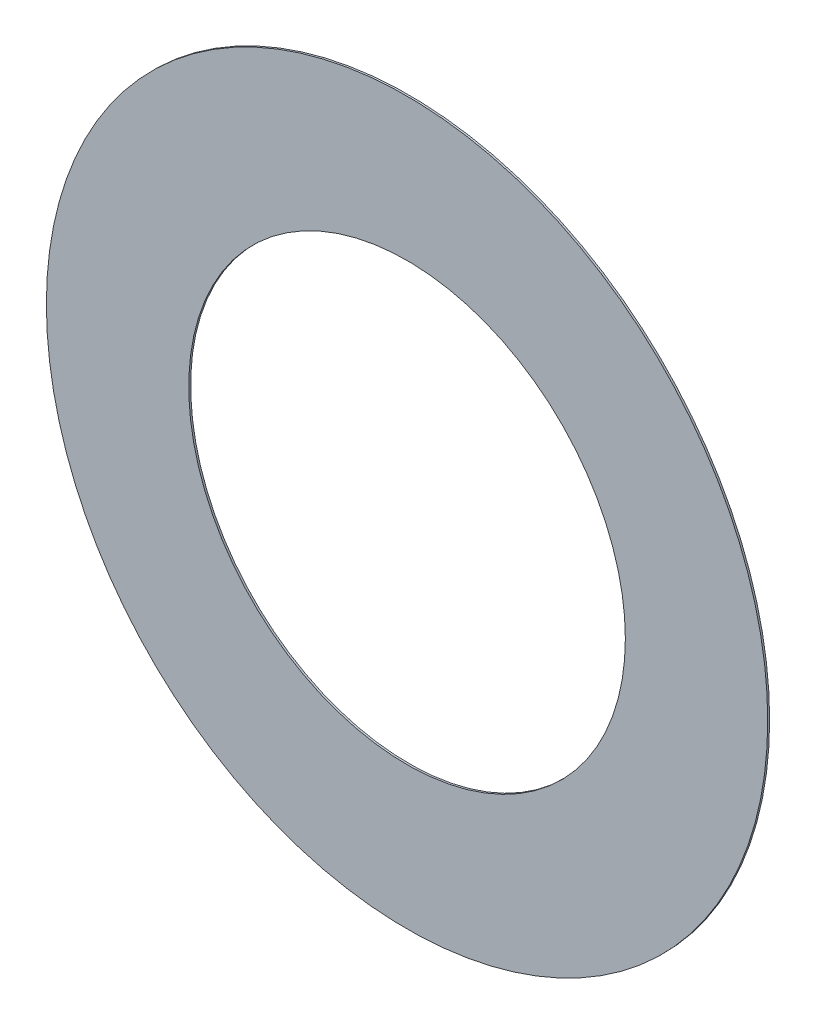
ISO-10303-21;
HEADER;
FILE_DESCRIPTION(('STEP AP214'),'2;1');
FILE_NAME('part.step','',(''),(''),'','','');
FILE_SCHEMA(('AUTOMOTIVE_DESIGN { 1 0 10303 214 1 1 1 1 }'));
ENDSEC;
DATA;
#1=APPLICATION_CONTEXT('core data for automotive mechanical design processes');
#2=APPLICATION_PROTOCOL_DEFINITION('international standard','automotive_design',2000,#1);
#3=PRODUCT_CONTEXT('',#1,'mechanical');
#4=PRODUCT('Part','Part','',(#3));
#5=PRODUCT_RELATED_PRODUCT_CATEGORY('part','',(#4));
#6=PRODUCT_DEFINITION_FORMATION('','',#4);
#7=PRODUCT_DEFINITION_CONTEXT('part definition',#1,'design');
#8=PRODUCT_DEFINITION('design','',#6,#7);
#9=PRODUCT_DEFINITION_SHAPE('','',#8);
#10=(LENGTH_UNIT() NAMED_UNIT(*) SI_UNIT(.MILLI.,.METRE.));
#11=(NAMED_UNIT(*) PLANE_ANGLE_UNIT() SI_UNIT($,.RADIAN.));
#12=(NAMED_UNIT(*) SI_UNIT($,.STERADIAN.) SOLID_ANGLE_UNIT());
#13=UNCERTAINTY_MEASURE_WITH_UNIT(LENGTH_MEASURE(1.E-05),#10,'distance_accuracy_value','');
#14=(GEOMETRIC_REPRESENTATION_CONTEXT(3) GLOBAL_UNCERTAINTY_ASSIGNED_CONTEXT((#13)) GLOBAL_UNIT_ASSIGNED_CONTEXT((#10,
#11,#12)) REPRESENTATION_CONTEXT('',''));
#15=CARTESIAN_POINT('',(0.,0.,0.));
#16=DIRECTION('',(0.,0.,1.));
#17=DIRECTION('',(1.,0.,0.));
#18=AXIS2_PLACEMENT_3D('',#15,#16,#17);
#19=CARTESIAN_POINT('',(-57.16,27.,0.1));
#20=DIRECTION('',(0.,0.,1.));
#21=DIRECTION('',(1.,0.,0.));
#22=AXIS2_PLACEMENT_3D('',#19,#20,#21);
#23=PLANE('',#22);
#24=CARTESIAN_POINT('',(-57.16,27.,0.1));
#25=DIRECTION('',(0.,0.,1.));
#26=DIRECTION('',(1.,0.,0.));
#27=AXIS2_PLACEMENT_3D('',#24,#25,#26);
#28=CIRCLE('',#27,19.);
#29=CARTESIAN_POINT('',(-38.16,27.,0.1));
#30=VERTEX_POINT('',#29);
#31=EDGE_CURVE('E10',#30,#30,#28,.T.);
#32=ORIENTED_EDGE('',*,*,#31,.T.);
#33=EDGE_LOOP('',(#32));
#34=FACE_BOUND('',#33,.T.);
#35=CARTESIAN_POINT('',(-57.16,27.,0.1));
#36=DIRECTION('',(0.,0.,1.));
#37=DIRECTION('',(1.,0.,0.));
#38=AXIS2_PLACEMENT_3D('',#35,#36,#37);
#39=CIRCLE('',#38,11.5);
#40=CARTESIAN_POINT('',(-45.66,27.,0.1));
#41=VERTEX_POINT('',#40);
#42=EDGE_CURVE('E50',#41,#41,#39,.T.);
#43=ORIENTED_EDGE('',*,*,#42,.F.);
#44=EDGE_LOOP('',(#43));
#45=FACE_BOUND('',#44,.T.);
#46=ADVANCED_FACE('F39',(#34,#45),#23,.T.);
#47=CARTESIAN_POINT('',(-57.16,27.,0.));
#48=DIRECTION('',(0.,0.,1.));
#49=DIRECTION('',(1.,0.,0.));
#50=AXIS2_PLACEMENT_3D('',#47,#48,#49);
#51=PLANE('',#50);
#52=CARTESIAN_POINT('',(-57.16,27.,0.));
#53=DIRECTION('',(0.,0.,1.));
#54=DIRECTION('',(1.,0.,0.));
#55=AXIS2_PLACEMENT_3D('',#52,#53,#54);
#56=CIRCLE('',#55,19.);
#57=CARTESIAN_POINT('',(-38.16,27.,0.));
#58=VERTEX_POINT('',#57);
#59=EDGE_CURVE('E43',#58,#58,#56,.T.);
#60=ORIENTED_EDGE('',*,*,#59,.F.);
#61=EDGE_LOOP('',(#60));
#62=FACE_BOUND('',#61,.T.);
#63=CARTESIAN_POINT('',(-57.16,27.,0.));
#64=DIRECTION('',(0.,0.,1.));
#65=DIRECTION('',(1.,0.,0.));
#66=AXIS2_PLACEMENT_3D('',#63,#64,#65);
#67=CIRCLE('',#66,11.5);
#68=CARTESIAN_POINT('',(-45.66,27.,0.));
#69=VERTEX_POINT('',#68);
#70=EDGE_CURVE('E52',#69,#69,#67,.T.);
#71=ORIENTED_EDGE('',*,*,#70,.T.);
#72=EDGE_LOOP('',(#71));
#73=FACE_BOUND('',#72,.T.);
#74=ADVANCED_FACE('F62',(#62,#73),#51,.F.);
#75=CARTESIAN_POINT('',(-57.16,27.,0.1));
#76=DIRECTION('',(0.,0.,-1.));
#77=DIRECTION('',(-1.,0.,0.));
#78=AXIS2_PLACEMENT_3D('',#75,#76,#77);
#79=CYLINDRICAL_SURFACE('',#78,19.);
#80=ORIENTED_EDGE('',*,*,#31,.F.);
#81=EDGE_LOOP('',(#80));
#82=FACE_BOUND('',#81,.T.);
#83=ORIENTED_EDGE('',*,*,#59,.T.);
#84=EDGE_LOOP('',(#83));
#85=FACE_BOUND('',#84,.T.);
#86=ADVANCED_FACE('F41',(#82,#85),#79,.T.);
#87=CARTESIAN_POINT('',(-57.16,27.,0.1));
#88=DIRECTION('',(0.,0.,-1.));
#89=DIRECTION('',(-1.,0.,0.));
#90=AXIS2_PLACEMENT_3D('',#87,#88,#89);
#91=CYLINDRICAL_SURFACE('',#90,11.5);
#92=ORIENTED_EDGE('',*,*,#42,.T.);
#93=EDGE_LOOP('',(#92));
#94=FACE_BOUND('',#93,.T.);
#95=ORIENTED_EDGE('',*,*,#70,.F.);
#96=EDGE_LOOP('',(#95));
#97=FACE_BOUND('',#96,.T.);
#98=ADVANCED_FACE('F58',(#94,#97),#91,.F.);
#99=CLOSED_SHELL('',(#46,#74,#86,#98));
#100=MANIFOLD_SOLID_BREP('B2',#99);
#101=ADVANCED_BREP_SHAPE_REPRESENTATION('',(#18,#100),#14);
#102=SHAPE_DEFINITION_REPRESENTATION(#9,#101);
ENDSEC;
END-ISO-10303-21;
